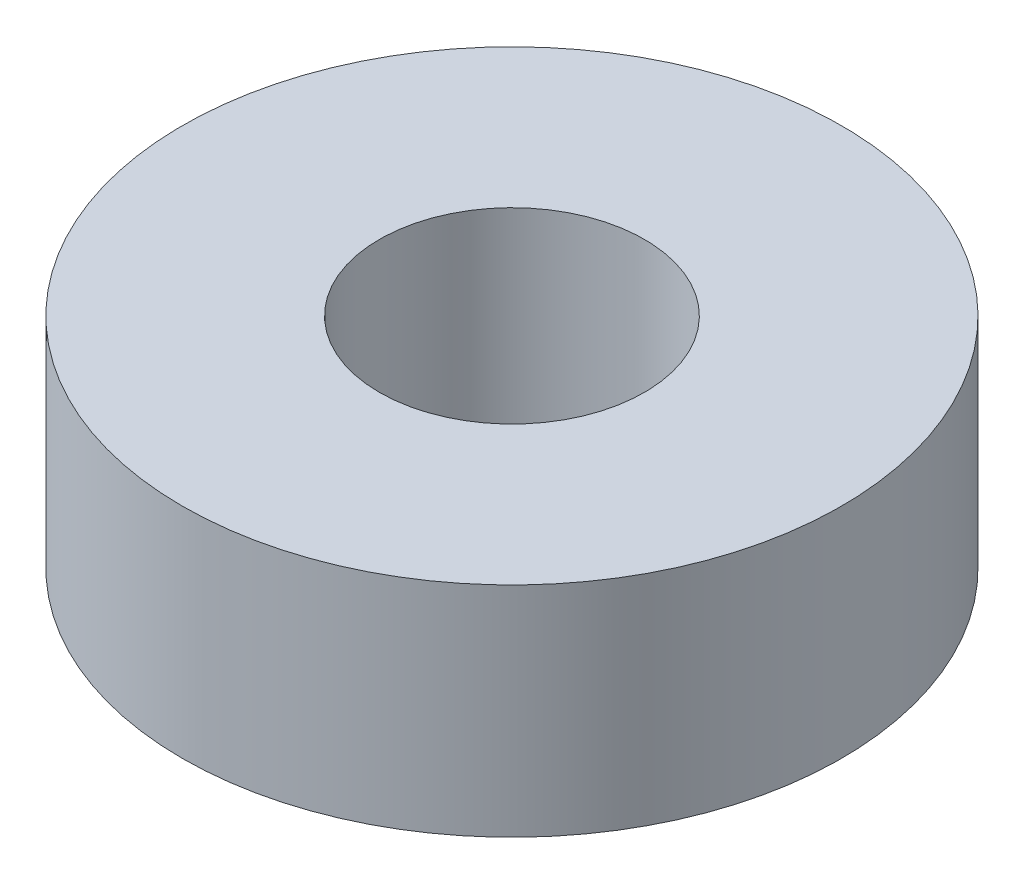
ISO-10303-21;
HEADER;
FILE_DESCRIPTION(('STEP AP214'),'2;1');
FILE_NAME('part.step','',(''),(''),'','','');
FILE_SCHEMA(('AUTOMOTIVE_DESIGN { 1 0 10303 214 1 1 1 1 }'));
ENDSEC;
DATA;
#1=APPLICATION_CONTEXT('core data for automotive mechanical design processes');
#2=APPLICATION_PROTOCOL_DEFINITION('international standard','automotive_design',2000,#1);
#3=PRODUCT_CONTEXT('',#1,'mechanical');
#4=PRODUCT('Part','Part','',(#3));
#5=PRODUCT_RELATED_PRODUCT_CATEGORY('part','',(#4));
#6=PRODUCT_DEFINITION_FORMATION('','',#4);
#7=PRODUCT_DEFINITION_CONTEXT('part definition',#1,'design');
#8=PRODUCT_DEFINITION('design','',#6,#7);
#9=PRODUCT_DEFINITION_SHAPE('','',#8);
#10=(LENGTH_UNIT() NAMED_UNIT(*) SI_UNIT(.MILLI.,.METRE.));
#11=(NAMED_UNIT(*) PLANE_ANGLE_UNIT() SI_UNIT($,.RADIAN.));
#12=(NAMED_UNIT(*) SI_UNIT($,.STERADIAN.) SOLID_ANGLE_UNIT());
#13=UNCERTAINTY_MEASURE_WITH_UNIT(LENGTH_MEASURE(1.E-05),#10,'distance_accuracy_value','');
#14=(GEOMETRIC_REPRESENTATION_CONTEXT(3) GLOBAL_UNCERTAINTY_ASSIGNED_CONTEXT((#13)) GLOBAL_UNIT_ASSIGNED_CONTEXT((#10,
#11,#12)) REPRESENTATION_CONTEXT('',''));
#15=CARTESIAN_POINT('',(0.,0.,0.));
#16=DIRECTION('',(0.,0.,1.));
#17=DIRECTION('',(1.,0.,0.));
#18=AXIS2_PLACEMENT_3D('',#15,#16,#17);
#19=CARTESIAN_POINT('',(0.,3.05,0.));
#20=DIRECTION('',(0.,1.,0.));
#21=DIRECTION('',(0.,0.,1.));
#22=AXIS2_PLACEMENT_3D('',#19,#20,#21);
#23=PLANE('',#22);
#24=CARTESIAN_POINT('',(0.,3.05,0.));
#25=DIRECTION('',(0.,1.,0.));
#26=DIRECTION('',(0.,0.,1.));
#27=AXIS2_PLACEMENT_3D('',#24,#25,#26);
#28=CIRCLE('',#27,3.7);
#29=CARTESIAN_POINT('',(0.,3.05,3.7));
#30=VERTEX_POINT('',#29);
#31=EDGE_CURVE('E52',#30,#30,#28,.T.);
#32=ORIENTED_EDGE('',*,*,#31,.F.);
#33=EDGE_LOOP('',(#32));
#34=FACE_BOUND('',#33,.T.);
#35=CARTESIAN_POINT('',(0.,3.05,0.));
#36=DIRECTION('',(0.,1.,0.));
#37=DIRECTION('',(0.,0.,1.));
#38=AXIS2_PLACEMENT_3D('',#35,#36,#37);
#39=CIRCLE('',#38,9.2);
#40=CARTESIAN_POINT('',(0.,3.05,9.2));
#41=VERTEX_POINT('',#40);
#42=EDGE_CURVE('E10',#41,#41,#39,.T.);
#43=ORIENTED_EDGE('',*,*,#42,.T.);
#44=EDGE_LOOP('',(#43));
#45=FACE_BOUND('',#44,.T.);
#46=ADVANCED_FACE('F41',(#34,#45),#23,.T.);
#47=CARTESIAN_POINT('',(0.,-3.05,0.));
#48=DIRECTION('',(0.,1.,0.));
#49=DIRECTION('',(0.,0.,1.));
#50=AXIS2_PLACEMENT_3D('',#47,#48,#49);
#51=PLANE('',#50);
#52=CARTESIAN_POINT('',(0.,-3.05,0.));
#53=DIRECTION('',(0.,1.,0.));
#54=DIRECTION('',(0.,0.,1.));
#55=AXIS2_PLACEMENT_3D('',#52,#53,#54);
#56=CIRCLE('',#55,3.7);
#57=CARTESIAN_POINT('',(0.,-3.05,3.7));
#58=VERTEX_POINT('',#57);
#59=EDGE_CURVE('E56',#58,#58,#56,.T.);
#60=ORIENTED_EDGE('',*,*,#59,.T.);
#61=EDGE_LOOP('',(#60));
#62=FACE_BOUND('',#61,.T.);
#63=CARTESIAN_POINT('',(0.,-3.05,0.));
#64=DIRECTION('',(0.,1.,0.));
#65=DIRECTION('',(0.,0.,1.));
#66=AXIS2_PLACEMENT_3D('',#63,#64,#65);
#67=CIRCLE('',#66,9.2);
#68=CARTESIAN_POINT('',(0.,-3.05,9.2));
#69=VERTEX_POINT('',#68);
#70=EDGE_CURVE('E48',#69,#69,#67,.T.);
#71=ORIENTED_EDGE('',*,*,#70,.F.);
#72=EDGE_LOOP('',(#71));
#73=FACE_BOUND('',#72,.T.);
#74=ADVANCED_FACE('F43',(#62,#73),#51,.F.);
#75=CARTESIAN_POINT('',(0.,-3.05,0.));
#76=DIRECTION('',(0.,1.,0.));
#77=DIRECTION('',(0.,0.,1.));
#78=AXIS2_PLACEMENT_3D('',#75,#76,#77);
#79=CYLINDRICAL_SURFACE('',#78,9.2);
#80=ORIENTED_EDGE('',*,*,#42,.F.);
#81=EDGE_LOOP('',(#80));
#82=FACE_BOUND('',#81,.T.);
#83=ORIENTED_EDGE('',*,*,#70,.T.);
#84=EDGE_LOOP('',(#83));
#85=FACE_BOUND('',#84,.T.);
#86=ADVANCED_FACE('F66',(#82,#85),#79,.T.);
#87=CARTESIAN_POINT('',(0.,-3.05,0.));
#88=DIRECTION('',(0.,1.,0.));
#89=DIRECTION('',(0.,0.,1.));
#90=AXIS2_PLACEMENT_3D('',#87,#88,#89);
#91=CYLINDRICAL_SURFACE('',#90,3.7);
#92=ORIENTED_EDGE('',*,*,#31,.T.);
#93=EDGE_LOOP('',(#92));
#94=FACE_BOUND('',#93,.T.);
#95=ORIENTED_EDGE('',*,*,#59,.F.);
#96=EDGE_LOOP('',(#95));
#97=FACE_BOUND('',#96,.T.);
#98=ADVANCED_FACE('F64',(#94,#97),#91,.F.);
#99=CLOSED_SHELL('',(#46,#74,#86,#98));
#100=MANIFOLD_SOLID_BREP('B2',#99);
#101=ADVANCED_BREP_SHAPE_REPRESENTATION('',(#18,#100),#14);
#102=SHAPE_DEFINITION_REPRESENTATION(#9,#101);
ENDSEC;
END-ISO-10303-21;
